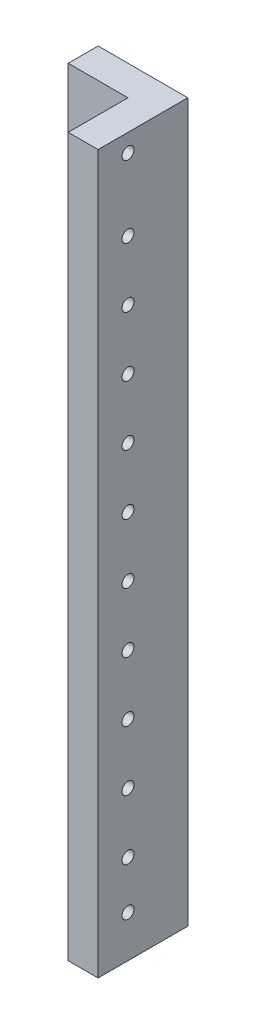
ISO-10303-21;
HEADER;
FILE_DESCRIPTION(('STEP AP214'),'2;1');
FILE_NAME('part.step','',(''),(''),'','','');
FILE_SCHEMA(('AUTOMOTIVE_DESIGN { 1 0 10303 214 1 1 1 1 }'));
ENDSEC;
DATA;
#1=APPLICATION_CONTEXT('core data for automotive mechanical design processes');
#2=APPLICATION_PROTOCOL_DEFINITION('international standard','automotive_design',2000,#1);
#3=PRODUCT_CONTEXT('',#1,'mechanical');
#4=PRODUCT('Part','Part','',(#3));
#5=PRODUCT_RELATED_PRODUCT_CATEGORY('part','',(#4));
#6=PRODUCT_DEFINITION_FORMATION('','',#4);
#7=PRODUCT_DEFINITION_CONTEXT('part definition',#1,'design');
#8=PRODUCT_DEFINITION('design','',#6,#7);
#9=PRODUCT_DEFINITION_SHAPE('','',#8);
#10=(LENGTH_UNIT() NAMED_UNIT(*) SI_UNIT(.MILLI.,.METRE.));
#11=(NAMED_UNIT(*) PLANE_ANGLE_UNIT() SI_UNIT($,.RADIAN.));
#12=(NAMED_UNIT(*) SI_UNIT($,.STERADIAN.) SOLID_ANGLE_UNIT());
#13=UNCERTAINTY_MEASURE_WITH_UNIT(LENGTH_MEASURE(1.E-05),#10,'distance_accuracy_value','');
#14=(GEOMETRIC_REPRESENTATION_CONTEXT(3) GLOBAL_UNCERTAINTY_ASSIGNED_CONTEXT((#13)) GLOBAL_UNIT_ASSIGNED_CONTEXT((#10,
#11,#12)) REPRESENTATION_CONTEXT('',''));
#15=CARTESIAN_POINT('',(0.,0.,0.));
#16=DIRECTION('',(0.,0.,1.));
#17=DIRECTION('',(1.,0.,0.));
#18=AXIS2_PLACEMENT_3D('',#15,#16,#17);
#19=CARTESIAN_POINT('',(-19.6614787517642,120.,-6.60714285714286));
#20=DIRECTION('',(1.,0.,0.));
#21=DIRECTION('',(0.,0.,-1.));
#22=AXIS2_PLACEMENT_3D('',#19,#20,#21);
#23=PLANE('',#22);
#24=DIRECTION('',(0.,0.,1.));
#25=VECTOR('',#24,1.);
#26=CARTESIAN_POINT('',(-19.6614787517642,0.,-6.60714285714286));
#27=LINE('',#26,#25);
#28=CARTESIAN_POINT('',(-19.6614787517642,0.,-6.60714285714286));
#29=VERTEX_POINT('',#28);
#30=CARTESIAN_POINT('',(-19.6614787517642,0.,-1.60714285714286));
#31=VERTEX_POINT('',#30);
#32=EDGE_CURVE('E119',#29,#31,#27,.T.);
#33=ORIENTED_EDGE('',*,*,#32,.T.);
#34=DIRECTION('',(0.,-1.,0.));
#35=VECTOR('',#34,1.);
#36=CARTESIAN_POINT('',(-19.6614787517642,120.,-1.60714285714286));
#37=LINE('',#36,#35);
#38=CARTESIAN_POINT('',(-19.6614787517642,120.,-1.60714285714286));
#39=VERTEX_POINT('',#38);
#40=EDGE_CURVE('E11',#39,#31,#37,.T.);
#41=ORIENTED_EDGE('',*,*,#40,.F.);
#42=DIRECTION('',(0.,0.,1.));
#43=VECTOR('',#42,1.);
#44=CARTESIAN_POINT('',(-19.6614787517642,120.,-6.60714285714286));
#45=LINE('',#44,#43);
#46=CARTESIAN_POINT('',(-19.6614787517642,120.,-6.60714285714286));
#47=VERTEX_POINT('',#46);
#48=EDGE_CURVE('E130',#47,#39,#45,.T.);
#49=ORIENTED_EDGE('',*,*,#48,.F.);
#50=DIRECTION('',(0.,-1.,0.));
#51=VECTOR('',#50,1.);
#52=CARTESIAN_POINT('',(-19.6614787517642,120.,-6.60714285714286));
#53=LINE('',#52,#51);
#54=EDGE_CURVE('E115',#47,#29,#53,.T.);
#55=ORIENTED_EDGE('',*,*,#54,.T.);
#56=EDGE_LOOP('',(#33,#41,#49,#55));
#57=FACE_BOUND('',#56,.T.);
#58=ADVANCED_FACE('F35',(#57),#23,.F.);
#59=CARTESIAN_POINT('',(-19.6614787517642,120.,-1.60714285714286));
#60=DIRECTION('',(0.,0.,-1.));
#61=DIRECTION('',(-1.,0.,0.));
#62=AXIS2_PLACEMENT_3D('',#59,#60,#61);
#63=PLANE('',#62);
#64=CARTESIAN_POINT('',(-14.6614787517642,15.,-1.60714285714285));
#65=DIRECTION('',(0.,0.,-1.));
#66=DIRECTION('',(-1.,0.,0.));
#67=AXIS2_PLACEMENT_3D('',#64,#65,#66);
#68=CIRCLE('',#67,1.);
#69=CARTESIAN_POINT('',(-15.6614787517642,15.,-1.60714285714285));
#70=VERTEX_POINT('',#69);
#71=EDGE_CURVE('E515',#70,#70,#68,.T.);
#72=ORIENTED_EDGE('',*,*,#71,.T.);
#73=EDGE_LOOP('',(#72));
#74=FACE_BOUND('',#73,.T.);
#75=CARTESIAN_POINT('',(-14.6614787517641,25.,-1.60714285714285));
#76=DIRECTION('',(0.,0.,-1.));
#77=DIRECTION('',(-1.,0.,0.));
#78=AXIS2_PLACEMENT_3D('',#75,#76,#77);
#79=CIRCLE('',#78,1.);
#80=CARTESIAN_POINT('',(-15.6614787517641,25.,-1.60714285714285));
#81=VERTEX_POINT('',#80);
#82=EDGE_CURVE('E542',#81,#81,#79,.T.);
#83=ORIENTED_EDGE('',*,*,#82,.T.);
#84=EDGE_LOOP('',(#83));
#85=FACE_BOUND('',#84,.T.);
#86=CARTESIAN_POINT('',(-14.6614787517641,35.,-1.60714285714285));
#87=DIRECTION('',(0.,0.,-1.));
#88=DIRECTION('',(-1.,0.,0.));
#89=AXIS2_PLACEMENT_3D('',#86,#87,#88);
#90=CIRCLE('',#89,1.);
#91=CARTESIAN_POINT('',(-15.6614787517641,35.,-1.60714285714285));
#92=VERTEX_POINT('',#91);
#93=EDGE_CURVE('E545',#92,#92,#90,.T.);
#94=ORIENTED_EDGE('',*,*,#93,.T.);
#95=EDGE_LOOP('',(#94));
#96=FACE_BOUND('',#95,.T.);
#97=CARTESIAN_POINT('',(-14.661478751764,45.,-1.60714285714285));
#98=DIRECTION('',(0.,0.,-1.));
#99=DIRECTION('',(-1.,0.,0.));
#100=AXIS2_PLACEMENT_3D('',#97,#98,#99);
#101=CIRCLE('',#100,1.);
#102=CARTESIAN_POINT('',(-15.661478751764,45.,-1.60714285714285));
#103=VERTEX_POINT('',#102);
#104=EDGE_CURVE('E548',#103,#103,#101,.T.);
#105=ORIENTED_EDGE('',*,*,#104,.T.);
#106=EDGE_LOOP('',(#105));
#107=FACE_BOUND('',#106,.T.);
#108=CARTESIAN_POINT('',(-14.661478751764,55.,-1.60714285714285));
#109=DIRECTION('',(0.,0.,-1.));
#110=DIRECTION('',(-1.,0.,0.));
#111=AXIS2_PLACEMENT_3D('',#108,#109,#110);
#112=CIRCLE('',#111,1.);
#113=CARTESIAN_POINT('',(-15.661478751764,55.,-1.60714285714285));
#114=VERTEX_POINT('',#113);
#115=EDGE_CURVE('E551',#114,#114,#112,.T.);
#116=ORIENTED_EDGE('',*,*,#115,.T.);
#117=EDGE_LOOP('',(#116));
#118=FACE_BOUND('',#117,.T.);
#119=CARTESIAN_POINT('',(-14.661478751764,65.,-1.60714285714285));
#120=DIRECTION('',(0.,0.,-1.));
#121=DIRECTION('',(-1.,0.,0.));
#122=AXIS2_PLACEMENT_3D('',#119,#120,#121);
#123=CIRCLE('',#122,1.);
#124=CARTESIAN_POINT('',(-15.661478751764,65.,-1.60714285714285));
#125=VERTEX_POINT('',#124);
#126=EDGE_CURVE('E554',#125,#125,#123,.T.);
#127=ORIENTED_EDGE('',*,*,#126,.T.);
#128=EDGE_LOOP('',(#127));
#129=FACE_BOUND('',#128,.T.);
#130=CARTESIAN_POINT('',(-14.6614787517639,75.,-1.60714285714285));
#131=DIRECTION('',(0.,0.,-1.));
#132=DIRECTION('',(-1.,0.,0.));
#133=AXIS2_PLACEMENT_3D('',#130,#131,#132);
#134=CIRCLE('',#133,1.);
#135=CARTESIAN_POINT('',(-15.6614787517639,75.,-1.60714285714285));
#136=VERTEX_POINT('',#135);
#137=EDGE_CURVE('E557',#136,#136,#134,.T.);
#138=ORIENTED_EDGE('',*,*,#137,.T.);
#139=EDGE_LOOP('',(#138));
#140=FACE_BOUND('',#139,.T.);
#141=CARTESIAN_POINT('',(-14.6614787517639,85.,-1.60714285714285));
#142=DIRECTION('',(0.,0.,-1.));
#143=DIRECTION('',(-1.,0.,0.));
#144=AXIS2_PLACEMENT_3D('',#141,#142,#143);
#145=CIRCLE('',#144,1.);
#146=CARTESIAN_POINT('',(-15.6614787517639,85.,-1.60714285714285));
#147=VERTEX_POINT('',#146);
#148=EDGE_CURVE('E560',#147,#147,#145,.T.);
#149=ORIENTED_EDGE('',*,*,#148,.T.);
#150=EDGE_LOOP('',(#149));
#151=FACE_BOUND('',#150,.T.);
#152=CARTESIAN_POINT('',(-14.6614787517639,95.,-1.60714285714285));
#153=DIRECTION('',(0.,0.,-1.));
#154=DIRECTION('',(-1.,0.,0.));
#155=AXIS2_PLACEMENT_3D('',#152,#153,#154);
#156=CIRCLE('',#155,1.);
#157=CARTESIAN_POINT('',(-15.6614787517639,95.,-1.60714285714285));
#158=VERTEX_POINT('',#157);
#159=EDGE_CURVE('E563',#158,#158,#156,.T.);
#160=ORIENTED_EDGE('',*,*,#159,.T.);
#161=EDGE_LOOP('',(#160));
#162=FACE_BOUND('',#161,.T.);
#163=CARTESIAN_POINT('',(-14.6614787517638,105.,-1.60714285714285));
#164=DIRECTION('',(0.,0.,-1.));
#165=DIRECTION('',(-1.,0.,0.));
#166=AXIS2_PLACEMENT_3D('',#163,#164,#165);
#167=CIRCLE('',#166,1.);
#168=CARTESIAN_POINT('',(-15.6614787517638,105.,-1.60714285714285));
#169=VERTEX_POINT('',#168);
#170=EDGE_CURVE('E566',#169,#169,#167,.T.);
#171=ORIENTED_EDGE('',*,*,#170,.T.);
#172=EDGE_LOOP('',(#171));
#173=FACE_BOUND('',#172,.T.);
#174=CARTESIAN_POINT('',(-14.6614787517642,3.,-1.60714285714285));
#175=DIRECTION('',(0.,0.,-1.));
#176=DIRECTION('',(-1.,0.,0.));
#177=AXIS2_PLACEMENT_3D('',#174,#175,#176);
#178=CIRCLE('',#177,1.);
#179=CARTESIAN_POINT('',(-15.6614787517642,3.,-1.60714285714285));
#180=VERTEX_POINT('',#179);
#181=EDGE_CURVE('E474',#180,#180,#178,.T.);
#182=ORIENTED_EDGE('',*,*,#181,.T.);
#183=EDGE_LOOP('',(#182));
#184=FACE_BOUND('',#183,.T.);
#185=CARTESIAN_POINT('',(-14.6614787517642,113.,-1.60714285714285));
#186=DIRECTION('',(0.,0.,-1.));
#187=DIRECTION('',(-1.,0.,0.));
#188=AXIS2_PLACEMENT_3D('',#185,#186,#187);
#189=CIRCLE('',#188,1.);
#190=CARTESIAN_POINT('',(-15.6614787517642,113.,-1.60714285714285));
#191=VERTEX_POINT('',#190);
#192=EDGE_CURVE('E458',#191,#191,#189,.T.);
#193=ORIENTED_EDGE('',*,*,#192,.T.);
#194=EDGE_LOOP('',(#193));
#195=FACE_BOUND('',#194,.T.);
#196=DIRECTION('',(1.,0.,0.));
#197=VECTOR('',#196,1.);
#198=CARTESIAN_POINT('',(-19.6614787517642,0.,-1.60714285714286));
#199=LINE('',#198,#197);
#200=CARTESIAN_POINT('',(-9.66147875176415,0.,-1.60714285714286));
#201=VERTEX_POINT('',#200);
#202=EDGE_CURVE('E122',#31,#201,#199,.T.);
#203=ORIENTED_EDGE('',*,*,#202,.T.);
#204=DIRECTION('',(0.,-1.,0.));
#205=VECTOR('',#204,1.);
#206=CARTESIAN_POINT('',(-9.66147875176415,120.,-1.60714285714286));
#207=LINE('',#206,#205);
#208=CARTESIAN_POINT('',(-9.66147875176415,120.,-1.60714285714286));
#209=VERTEX_POINT('',#208);
#210=EDGE_CURVE('E43',#209,#201,#207,.T.);
#211=ORIENTED_EDGE('',*,*,#210,.F.);
#212=DIRECTION('',(1.,0.,0.));
#213=VECTOR('',#212,1.);
#214=CARTESIAN_POINT('',(-19.6614787517642,120.,-1.60714285714286));
#215=LINE('',#214,#213);
#216=EDGE_CURVE('E88',#39,#209,#215,.T.);
#217=ORIENTED_EDGE('',*,*,#216,.F.);
#218=ORIENTED_EDGE('',*,*,#40,.T.);
#219=EDGE_LOOP('',(#203,#211,#217,#218));
#220=FACE_BOUND('',#219,.T.);
#221=ADVANCED_FACE('F158',(#74,#85,#96,#107,#118,#129,#140,#151,#162,#173,#184,#195,#220),#63,.F.);
#222=CARTESIAN_POINT('',(-9.66147875176415,120.,-1.60714285714286));
#223=DIRECTION('',(1.,0.,0.));
#224=DIRECTION('',(0.,0.,-1.));
#225=AXIS2_PLACEMENT_3D('',#222,#223,#224);
#226=PLANE('',#225);
#227=CARTESIAN_POINT('',(-9.66147875176415,105.,3.39285714285714));
#228=DIRECTION('',(1.,0.,0.));
#229=DIRECTION('',(0.,0.,-1.));
#230=AXIS2_PLACEMENT_3D('',#227,#228,#229);
#231=CIRCLE('',#230,1.);
#232=CARTESIAN_POINT('',(-9.66147875176415,105.,2.39285714285714));
#233=VERTEX_POINT('',#232);
#234=EDGE_CURVE('E480',#233,#233,#231,.T.);
#235=ORIENTED_EDGE('',*,*,#234,.T.);
#236=EDGE_LOOP('',(#235));
#237=FACE_BOUND('',#236,.T.);
#238=CARTESIAN_POINT('',(-9.66147875176415,95.,3.39285714285704));
#239=DIRECTION('',(1.,0.,0.));
#240=DIRECTION('',(0.,0.,-1.));
#241=AXIS2_PLACEMENT_3D('',#238,#239,#240);
#242=CIRCLE('',#241,1.);
#243=CARTESIAN_POINT('',(-9.66147875176415,95.,2.39285714285704));
#244=VERTEX_POINT('',#243);
#245=EDGE_CURVE('E483',#244,#244,#242,.T.);
#246=ORIENTED_EDGE('',*,*,#245,.T.);
#247=EDGE_LOOP('',(#246));
#248=FACE_BOUND('',#247,.T.);
#249=CARTESIAN_POINT('',(-9.66147875176415,85.,3.39285714285693));
#250=DIRECTION('',(1.,0.,0.));
#251=DIRECTION('',(0.,0.,-1.));
#252=AXIS2_PLACEMENT_3D('',#249,#250,#251);
#253=CIRCLE('',#252,1.);
#254=CARTESIAN_POINT('',(-9.66147875176415,85.,2.39285714285693));
#255=VERTEX_POINT('',#254);
#256=EDGE_CURVE('E486',#255,#255,#253,.T.);
#257=ORIENTED_EDGE('',*,*,#256,.T.);
#258=EDGE_LOOP('',(#257));
#259=FACE_BOUND('',#258,.T.);
#260=CARTESIAN_POINT('',(-9.66147875176415,75.,3.39285714285683));
#261=DIRECTION('',(1.,0.,0.));
#262=DIRECTION('',(0.,0.,-1.));
#263=AXIS2_PLACEMENT_3D('',#260,#261,#262);
#264=CIRCLE('',#263,1.);
#265=CARTESIAN_POINT('',(-9.66147875176415,75.,2.39285714285683));
#266=VERTEX_POINT('',#265);
#267=EDGE_CURVE('E489',#266,#266,#264,.T.);
#268=ORIENTED_EDGE('',*,*,#267,.T.);
#269=EDGE_LOOP('',(#268));
#270=FACE_BOUND('',#269,.T.);
#271=CARTESIAN_POINT('',(-9.66147875176415,65.,3.39285714285673));
#272=DIRECTION('',(1.,0.,0.));
#273=DIRECTION('',(0.,0.,-1.));
#274=AXIS2_PLACEMENT_3D('',#271,#272,#273);
#275=CIRCLE('',#274,1.);
#276=CARTESIAN_POINT('',(-9.66147875176415,65.,2.39285714285673));
#277=VERTEX_POINT('',#276);
#278=EDGE_CURVE('E492',#277,#277,#275,.T.);
#279=ORIENTED_EDGE('',*,*,#278,.T.);
#280=EDGE_LOOP('',(#279));
#281=FACE_BOUND('',#280,.T.);
#282=CARTESIAN_POINT('',(-9.66147875176415,55.,3.39285714285662));
#283=DIRECTION('',(1.,0.,0.));
#284=DIRECTION('',(0.,0.,-1.));
#285=AXIS2_PLACEMENT_3D('',#282,#283,#284);
#286=CIRCLE('',#285,1.);
#287=CARTESIAN_POINT('',(-9.66147875176415,55.,2.39285714285662));
#288=VERTEX_POINT('',#287);
#289=EDGE_CURVE('E495',#288,#288,#286,.T.);
#290=ORIENTED_EDGE('',*,*,#289,.T.);
#291=EDGE_LOOP('',(#290));
#292=FACE_BOUND('',#291,.T.);
#293=CARTESIAN_POINT('',(-9.66147875176415,45.,3.39285714285652));
#294=DIRECTION('',(1.,0.,0.));
#295=DIRECTION('',(0.,0.,-1.));
#296=AXIS2_PLACEMENT_3D('',#293,#294,#295);
#297=CIRCLE('',#296,1.);
#298=CARTESIAN_POINT('',(-9.66147875176415,45.,2.39285714285652));
#299=VERTEX_POINT('',#298);
#300=EDGE_CURVE('E498',#299,#299,#297,.T.);
#301=ORIENTED_EDGE('',*,*,#300,.T.);
#302=EDGE_LOOP('',(#301));
#303=FACE_BOUND('',#302,.T.);
#304=CARTESIAN_POINT('',(-9.66147875176415,35.,3.39285714285641));
#305=DIRECTION('',(1.,0.,0.));
#306=DIRECTION('',(0.,0.,-1.));
#307=AXIS2_PLACEMENT_3D('',#304,#305,#306);
#308=CIRCLE('',#307,1.);
#309=CARTESIAN_POINT('',(-9.66147875176415,35.,2.39285714285641));
#310=VERTEX_POINT('',#309);
#311=EDGE_CURVE('E501',#310,#310,#308,.T.);
#312=ORIENTED_EDGE('',*,*,#311,.T.);
#313=EDGE_LOOP('',(#312));
#314=FACE_BOUND('',#313,.T.);
#315=CARTESIAN_POINT('',(-9.66147875176415,25.,3.39285714285631));
#316=DIRECTION('',(1.,0.,0.));
#317=DIRECTION('',(0.,0.,-1.));
#318=AXIS2_PLACEMENT_3D('',#315,#316,#317);
#319=CIRCLE('',#318,1.);
#320=CARTESIAN_POINT('',(-9.66147875176415,25.,2.39285714285631));
#321=VERTEX_POINT('',#320);
#322=EDGE_CURVE('E504',#321,#321,#319,.T.);
#323=ORIENTED_EDGE('',*,*,#322,.T.);
#324=EDGE_LOOP('',(#323));
#325=FACE_BOUND('',#324,.T.);
#326=CARTESIAN_POINT('',(-9.66147875176415,15.,3.39285714285621));
#327=DIRECTION('',(1.,0.,0.));
#328=DIRECTION('',(0.,0.,-1.));
#329=AXIS2_PLACEMENT_3D('',#326,#327,#328);
#330=CIRCLE('',#329,1.);
#331=CARTESIAN_POINT('',(-9.66147875176415,15.,2.39285714285621));
#332=VERTEX_POINT('',#331);
#333=EDGE_CURVE('E507',#332,#332,#330,.T.);
#334=ORIENTED_EDGE('',*,*,#333,.T.);
#335=EDGE_LOOP('',(#334));
#336=FACE_BOUND('',#335,.T.);
#337=CARTESIAN_POINT('',(-9.66147875176415,7.00000000000001,3.39285714285714));
#338=DIRECTION('',(1.,0.,0.));
#339=DIRECTION('',(0.,0.,-1.));
#340=AXIS2_PLACEMENT_3D('',#337,#338,#339);
#341=CIRCLE('',#340,1.);
#342=CARTESIAN_POINT('',(-9.66147875176415,7.00000000000001,2.39285714285714));
#343=VERTEX_POINT('',#342);
#344=EDGE_CURVE('E468',#343,#343,#341,.T.);
#345=ORIENTED_EDGE('',*,*,#344,.T.);
#346=EDGE_LOOP('',(#345));
#347=FACE_BOUND('',#346,.T.);
#348=CARTESIAN_POINT('',(-9.66147875176415,117.,3.39285714285714));
#349=DIRECTION('',(1.,0.,0.));
#350=DIRECTION('',(0.,0.,-1.));
#351=AXIS2_PLACEMENT_3D('',#348,#349,#350);
#352=CIRCLE('',#351,1.);
#353=CARTESIAN_POINT('',(-9.66147875176415,117.,2.39285714285714));
#354=VERTEX_POINT('',#353);
#355=EDGE_CURVE('E123',#354,#354,#352,.T.);
#356=ORIENTED_EDGE('',*,*,#355,.T.);
#357=EDGE_LOOP('',(#356));
#358=FACE_BOUND('',#357,.T.);
#359=DIRECTION('',(0.,0.,1.));
#360=VECTOR('',#359,1.);
#361=CARTESIAN_POINT('',(-9.66147875176415,0.,-1.60714285714286));
#362=LINE('',#361,#360);
#363=CARTESIAN_POINT('',(-9.66147875176415,0.,8.39285714285714));
#364=VERTEX_POINT('',#363);
#365=EDGE_CURVE('E125',#201,#364,#362,.T.);
#366=ORIENTED_EDGE('',*,*,#365,.T.);
#367=DIRECTION('',(0.,-1.,0.));
#368=VECTOR('',#367,1.);
#369=CARTESIAN_POINT('',(-9.66147875176415,120.,8.39285714285714));
#370=LINE('',#369,#368);
#371=CARTESIAN_POINT('',(-9.66147875176415,120.,8.39285714285714));
#372=VERTEX_POINT('',#371);
#373=EDGE_CURVE('E110',#372,#364,#370,.T.);
#374=ORIENTED_EDGE('',*,*,#373,.F.);
#375=DIRECTION('',(0.,0.,1.));
#376=VECTOR('',#375,1.);
#377=CARTESIAN_POINT('',(-9.66147875176415,120.,-1.60714285714286));
#378=LINE('',#377,#376);
#379=EDGE_CURVE('E101',#209,#372,#378,.T.);
#380=ORIENTED_EDGE('',*,*,#379,.F.);
#381=ORIENTED_EDGE('',*,*,#210,.T.);
#382=EDGE_LOOP('',(#366,#374,#380,#381));
#383=FACE_BOUND('',#382,.T.);
#384=ADVANCED_FACE('F136',(#237,#248,#259,#270,#281,#292,#303,#314,#325,#336,#347,#358,#383),
#226,.F.);
#385=CARTESIAN_POINT('',(-4.66147875176415,120.,8.39285714285714));
#386=DIRECTION('',(0.,0.,-1.));
#387=DIRECTION('',(-1.,0.,0.));
#388=AXIS2_PLACEMENT_3D('',#385,#386,#387);
#389=PLANE('',#388);
#390=DIRECTION('',(1.,0.,0.));
#391=VECTOR('',#390,1.);
#392=CARTESIAN_POINT('',(-4.66147875176415,0.,8.39285714285714));
#393=LINE('',#392,#391);
#394=CARTESIAN_POINT('',(-4.66147875176415,0.,8.39285714285714));
#395=VERTEX_POINT('',#394);
#396=EDGE_CURVE('E109',#364,#395,#393,.T.);
#397=ORIENTED_EDGE('',*,*,#396,.T.);
#398=DIRECTION('',(0.,-1.,0.));
#399=VECTOR('',#398,1.);
#400=CARTESIAN_POINT('',(-4.66147875176415,120.,8.39285714285714));
#401=LINE('',#400,#399);
#402=CARTESIAN_POINT('',(-4.66147875176415,120.,8.39285714285714));
#403=VERTEX_POINT('',#402);
#404=EDGE_CURVE('E106',#403,#395,#401,.T.);
#405=ORIENTED_EDGE('',*,*,#404,.F.);
#406=DIRECTION('',(1.,0.,0.));
#407=VECTOR('',#406,1.);
#408=CARTESIAN_POINT('',(-4.66147875176415,120.,8.39285714285714));
#409=LINE('',#408,#407);
#410=EDGE_CURVE('E95',#372,#403,#409,.T.);
#411=ORIENTED_EDGE('',*,*,#410,.F.);
#412=ORIENTED_EDGE('',*,*,#373,.T.);
#413=EDGE_LOOP('',(#397,#405,#411,#412));
#414=FACE_BOUND('',#413,.T.);
#415=ADVANCED_FACE('F107',(#414),#389,.F.);
#416=CARTESIAN_POINT('',(-4.66147875176415,120.,-6.60714285714286));
#417=DIRECTION('',(-1.,0.,0.));
#418=DIRECTION('',(0.,0.,1.));
#419=AXIS2_PLACEMENT_3D('',#416,#417,#418);
#420=PLANE('',#419);
#421=CARTESIAN_POINT('',(-4.66147875176415,105.,3.39285714285714));
#422=DIRECTION('',(1.,0.,0.));
#423=DIRECTION('',(0.,0.,-1.));
#424=AXIS2_PLACEMENT_3D('',#421,#422,#423);
#425=CIRCLE('',#424,1.);
#426=CARTESIAN_POINT('',(-4.66147875176415,105.,2.39285714285714));
#427=VERTEX_POINT('',#426);
#428=EDGE_CURVE('E510',#427,#427,#425,.T.);
#429=ORIENTED_EDGE('',*,*,#428,.F.);
#430=EDGE_LOOP('',(#429));
#431=FACE_BOUND('',#430,.T.);
#432=CARTESIAN_POINT('',(-4.66147875176415,95.,3.39285714285704));
#433=DIRECTION('',(1.,0.,0.));
#434=DIRECTION('',(0.,0.,-1.));
#435=AXIS2_PLACEMENT_3D('',#432,#433,#434);
#436=CIRCLE('',#435,1.);
#437=CARTESIAN_POINT('',(-4.66147875176415,95.,2.39285714285704));
#438=VERTEX_POINT('',#437);
#439=EDGE_CURVE('E536',#438,#438,#436,.T.);
#440=ORIENTED_EDGE('',*,*,#439,.F.);
#441=EDGE_LOOP('',(#440));
#442=FACE_BOUND('',#441,.T.);
#443=CARTESIAN_POINT('',(-4.66147875176415,85.,3.39285714285693));
#444=DIRECTION('',(1.,0.,0.));
#445=DIRECTION('',(0.,0.,-1.));
#446=AXIS2_PLACEMENT_3D('',#443,#444,#445);
#447=CIRCLE('',#446,1.);
#448=CARTESIAN_POINT('',(-4.66147875176415,85.,2.39285714285693));
#449=VERTEX_POINT('',#448);
#450=EDGE_CURVE('E533',#449,#449,#447,.T.);
#451=ORIENTED_EDGE('',*,*,#450,.F.);
#452=EDGE_LOOP('',(#451));
#453=FACE_BOUND('',#452,.T.);
#454=CARTESIAN_POINT('',(-4.66147875176415,75.,3.39285714285683));
#455=DIRECTION('',(1.,0.,0.));
#456=DIRECTION('',(0.,0.,-1.));
#457=AXIS2_PLACEMENT_3D('',#454,#455,#456);
#458=CIRCLE('',#457,1.);
#459=CARTESIAN_POINT('',(-4.66147875176415,75.,2.39285714285683));
#460=VERTEX_POINT('',#459);
#461=EDGE_CURVE('E530',#460,#460,#458,.T.);
#462=ORIENTED_EDGE('',*,*,#461,.F.);
#463=EDGE_LOOP('',(#462));
#464=FACE_BOUND('',#463,.T.);
#465=CARTESIAN_POINT('',(-4.66147875176415,65.,3.39285714285673));
#466=DIRECTION('',(1.,0.,0.));
#467=DIRECTION('',(0.,0.,-1.));
#468=AXIS2_PLACEMENT_3D('',#465,#466,#467);
#469=CIRCLE('',#468,1.);
#470=CARTESIAN_POINT('',(-4.66147875176415,65.,2.39285714285673));
#471=VERTEX_POINT('',#470);
#472=EDGE_CURVE('E527',#471,#471,#469,.T.);
#473=ORIENTED_EDGE('',*,*,#472,.F.);
#474=EDGE_LOOP('',(#473));
#475=FACE_BOUND('',#474,.T.);
#476=CARTESIAN_POINT('',(-4.66147875176415,55.,3.39285714285662));
#477=DIRECTION('',(1.,0.,0.));
#478=DIRECTION('',(0.,0.,-1.));
#479=AXIS2_PLACEMENT_3D('',#476,#477,#478);
#480=CIRCLE('',#479,1.);
#481=CARTESIAN_POINT('',(-4.66147875176415,55.,2.39285714285662));
#482=VERTEX_POINT('',#481);
#483=EDGE_CURVE('E524',#482,#482,#480,.T.);
#484=ORIENTED_EDGE('',*,*,#483,.F.);
#485=EDGE_LOOP('',(#484));
#486=FACE_BOUND('',#485,.T.);
#487=CARTESIAN_POINT('',(-4.66147875176415,45.,3.39285714285652));
#488=DIRECTION('',(1.,0.,0.));
#489=DIRECTION('',(0.,0.,-1.));
#490=AXIS2_PLACEMENT_3D('',#487,#488,#489);
#491=CIRCLE('',#490,1.);
#492=CARTESIAN_POINT('',(-4.66147875176415,45.,2.39285714285652));
#493=VERTEX_POINT('',#492);
#494=EDGE_CURVE('E521',#493,#493,#491,.T.);
#495=ORIENTED_EDGE('',*,*,#494,.F.);
#496=EDGE_LOOP('',(#495));
#497=FACE_BOUND('',#496,.T.);
#498=CARTESIAN_POINT('',(-4.66147875176415,35.,3.39285714285641));
#499=DIRECTION('',(1.,0.,0.));
#500=DIRECTION('',(0.,0.,-1.));
#501=AXIS2_PLACEMENT_3D('',#498,#499,#500);
#502=CIRCLE('',#501,1.);
#503=CARTESIAN_POINT('',(-4.66147875176415,35.,2.39285714285641));
#504=VERTEX_POINT('',#503);
#505=EDGE_CURVE('E518',#504,#504,#502,.T.);
#506=ORIENTED_EDGE('',*,*,#505,.F.);
#507=EDGE_LOOP('',(#506));
#508=FACE_BOUND('',#507,.T.);
#509=CARTESIAN_POINT('',(-4.66147875176415,25.,3.39285714285631));
#510=DIRECTION('',(1.,0.,0.));
#511=DIRECTION('',(0.,0.,-1.));
#512=AXIS2_PLACEMENT_3D('',#509,#510,#511);
#513=CIRCLE('',#512,1.);
#514=CARTESIAN_POINT('',(-4.66147875176415,25.,2.39285714285631));
#515=VERTEX_POINT('',#514);
#516=EDGE_CURVE('E514',#515,#515,#513,.T.);
#517=ORIENTED_EDGE('',*,*,#516,.F.);
#518=EDGE_LOOP('',(#517));
#519=FACE_BOUND('',#518,.T.);
#520=CARTESIAN_POINT('',(-4.66147875176415,15.,3.39285714285621));
#521=DIRECTION('',(1.,0.,0.));
#522=DIRECTION('',(0.,0.,-1.));
#523=AXIS2_PLACEMENT_3D('',#520,#521,#522);
#524=CIRCLE('',#523,1.);
#525=CARTESIAN_POINT('',(-4.66147875176415,15.,2.3928571428562));
#526=VERTEX_POINT('',#525);
#527=EDGE_CURVE('E511',#526,#526,#524,.T.);
#528=ORIENTED_EDGE('',*,*,#527,.F.);
#529=EDGE_LOOP('',(#528));
#530=FACE_BOUND('',#529,.T.);
#531=CARTESIAN_POINT('',(-4.66147875176415,7.00000000000001,3.39285714285714));
#532=DIRECTION('',(1.,0.,0.));
#533=DIRECTION('',(0.,0.,-1.));
#534=AXIS2_PLACEMENT_3D('',#531,#532,#533);
#535=CIRCLE('',#534,1.);
#536=CARTESIAN_POINT('',(-4.66147875176415,7.00000000000001,2.39285714285714));
#537=VERTEX_POINT('',#536);
#538=EDGE_CURVE('E471',#537,#537,#535,.T.);
#539=ORIENTED_EDGE('',*,*,#538,.F.);
#540=EDGE_LOOP('',(#539));
#541=FACE_BOUND('',#540,.T.);
#542=CARTESIAN_POINT('',(-4.66147875176415,117.,3.39285714285714));
#543=DIRECTION('',(1.,0.,0.));
#544=DIRECTION('',(0.,0.,-1.));
#545=AXIS2_PLACEMENT_3D('',#542,#543,#544);
#546=CIRCLE('',#545,1.);
#547=CARTESIAN_POINT('',(-4.66147875176415,117.,2.39285714285714));
#548=VERTEX_POINT('',#547);
#549=EDGE_CURVE('E453',#548,#548,#546,.T.);
#550=ORIENTED_EDGE('',*,*,#549,.F.);
#551=EDGE_LOOP('',(#550));
#552=FACE_BOUND('',#551,.T.);
#553=DIRECTION('',(0.,0.,-1.));
#554=VECTOR('',#553,1.);
#555=CARTESIAN_POINT('',(-4.66147875176415,0.,-6.60714285714286));
#556=LINE('',#555,#554);
#557=CARTESIAN_POINT('',(-4.66147875176415,0.,-6.60714285714286));
#558=VERTEX_POINT('',#557);
#559=EDGE_CURVE('E74',#395,#558,#556,.T.);
#560=ORIENTED_EDGE('',*,*,#559,.T.);
#561=DIRECTION('',(0.,-1.,0.));
#562=VECTOR('',#561,1.);
#563=CARTESIAN_POINT('',(-4.66147875176415,120.,-6.60714285714286));
#564=LINE('',#563,#562);
#565=CARTESIAN_POINT('',(-4.66147875176415,120.,-6.60714285714286));
#566=VERTEX_POINT('',#565);
#567=EDGE_CURVE('E111',#566,#558,#564,.T.);
#568=ORIENTED_EDGE('',*,*,#567,.F.);
#569=DIRECTION('',(0.,0.,-1.));
#570=VECTOR('',#569,1.);
#571=CARTESIAN_POINT('',(-4.66147875176415,120.,-6.60714285714286));
#572=LINE('',#571,#570);
#573=EDGE_CURVE('E99',#403,#566,#572,.T.);
#574=ORIENTED_EDGE('',*,*,#573,.F.);
#575=ORIENTED_EDGE('',*,*,#404,.T.);
#576=EDGE_LOOP('',(#560,#568,#574,#575));
#577=FACE_BOUND('',#576,.T.);
#578=ADVANCED_FACE('F113',(#431,#442,#453,#464,#475,#486,#497,#508,#519,#530,#541,#552,#577),
#420,.F.);
#579=CARTESIAN_POINT('',(-19.6614787517642,120.,-6.60714285714286));
#580=DIRECTION('',(0.,0.,1.));
#581=DIRECTION('',(1.,0.,0.));
#582=AXIS2_PLACEMENT_3D('',#579,#580,#581);
#583=PLANE('',#582);
#584=CARTESIAN_POINT('',(-14.6614787517642,15.,-6.60714285714286));
#585=DIRECTION('',(0.,0.,-1.));
#586=DIRECTION('',(-1.,0.,0.));
#587=AXIS2_PLACEMENT_3D('',#584,#585,#586);
#588=CIRCLE('',#587,1.);
#589=CARTESIAN_POINT('',(-15.6614787517642,15.,-6.60714285714286));
#590=VERTEX_POINT('',#589);
#591=EDGE_CURVE('E569',#590,#590,#588,.T.);
#592=ORIENTED_EDGE('',*,*,#591,.F.);
#593=EDGE_LOOP('',(#592));
#594=FACE_BOUND('',#593,.T.);
#595=CARTESIAN_POINT('',(-14.6614787517641,25.,-6.60714285714286));
#596=DIRECTION('',(0.,0.,-1.));
#597=DIRECTION('',(-1.,0.,0.));
#598=AXIS2_PLACEMENT_3D('',#595,#596,#597);
#599=CIRCLE('',#598,1.);
#600=CARTESIAN_POINT('',(-15.6614787517641,25.,-6.60714285714286));
#601=VERTEX_POINT('',#600);
#602=EDGE_CURVE('E594',#601,#601,#599,.T.);
#603=ORIENTED_EDGE('',*,*,#602,.F.);
#604=EDGE_LOOP('',(#603));
#605=FACE_BOUND('',#604,.T.);
#606=CARTESIAN_POINT('',(-14.6614787517641,35.,-6.60714285714286));
#607=DIRECTION('',(0.,0.,-1.));
#608=DIRECTION('',(-1.,0.,0.));
#609=AXIS2_PLACEMENT_3D('',#606,#607,#608);
#610=CIRCLE('',#609,1.);
#611=CARTESIAN_POINT('',(-15.6614787517641,35.,-6.60714285714286));
#612=VERTEX_POINT('',#611);
#613=EDGE_CURVE('E591',#612,#612,#610,.T.);
#614=ORIENTED_EDGE('',*,*,#613,.F.);
#615=EDGE_LOOP('',(#614));
#616=FACE_BOUND('',#615,.T.);
#617=CARTESIAN_POINT('',(-14.661478751764,45.,-6.60714285714286));
#618=DIRECTION('',(0.,0.,-1.));
#619=DIRECTION('',(-1.,0.,0.));
#620=AXIS2_PLACEMENT_3D('',#617,#618,#619);
#621=CIRCLE('',#620,1.);
#622=CARTESIAN_POINT('',(-15.661478751764,45.,-6.60714285714286));
#623=VERTEX_POINT('',#622);
#624=EDGE_CURVE('E588',#623,#623,#621,.T.);
#625=ORIENTED_EDGE('',*,*,#624,.F.);
#626=EDGE_LOOP('',(#625));
#627=FACE_BOUND('',#626,.T.);
#628=CARTESIAN_POINT('',(-14.661478751764,55.,-6.60714285714286));
#629=DIRECTION('',(0.,0.,-1.));
#630=DIRECTION('',(-1.,0.,0.));
#631=AXIS2_PLACEMENT_3D('',#628,#629,#630);
#632=CIRCLE('',#631,1.);
#633=CARTESIAN_POINT('',(-15.661478751764,55.,-6.60714285714286));
#634=VERTEX_POINT('',#633);
#635=EDGE_CURVE('E585',#634,#634,#632,.T.);
#636=ORIENTED_EDGE('',*,*,#635,.F.);
#637=EDGE_LOOP('',(#636));
#638=FACE_BOUND('',#637,.T.);
#639=CARTESIAN_POINT('',(-14.661478751764,65.,-6.60714285714286));
#640=DIRECTION('',(0.,0.,-1.));
#641=DIRECTION('',(-1.,0.,0.));
#642=AXIS2_PLACEMENT_3D('',#639,#640,#641);
#643=CIRCLE('',#642,1.);
#644=CARTESIAN_POINT('',(-15.661478751764,65.,-6.60714285714286));
#645=VERTEX_POINT('',#644);
#646=EDGE_CURVE('E582',#645,#645,#643,.T.);
#647=ORIENTED_EDGE('',*,*,#646,.F.);
#648=EDGE_LOOP('',(#647));
#649=FACE_BOUND('',#648,.T.);
#650=CARTESIAN_POINT('',(-14.6614787517639,75.,-6.60714285714286));
#651=DIRECTION('',(0.,0.,-1.));
#652=DIRECTION('',(-1.,0.,0.));
#653=AXIS2_PLACEMENT_3D('',#650,#651,#652);
#654=CIRCLE('',#653,1.);
#655=CARTESIAN_POINT('',(-15.6614787517639,75.,-6.60714285714286));
#656=VERTEX_POINT('',#655);
#657=EDGE_CURVE('E579',#656,#656,#654,.T.);
#658=ORIENTED_EDGE('',*,*,#657,.F.);
#659=EDGE_LOOP('',(#658));
#660=FACE_BOUND('',#659,.T.);
#661=CARTESIAN_POINT('',(-14.6614787517639,85.,-6.60714285714286));
#662=DIRECTION('',(0.,0.,-1.));
#663=DIRECTION('',(-1.,0.,0.));
#664=AXIS2_PLACEMENT_3D('',#661,#662,#663);
#665=CIRCLE('',#664,1.);
#666=CARTESIAN_POINT('',(-15.6614787517639,85.,-6.60714285714286));
#667=VERTEX_POINT('',#666);
#668=EDGE_CURVE('E576',#667,#667,#665,.T.);
#669=ORIENTED_EDGE('',*,*,#668,.F.);
#670=EDGE_LOOP('',(#669));
#671=FACE_BOUND('',#670,.T.);
#672=CARTESIAN_POINT('',(-14.6614787517639,95.,-6.60714285714286));
#673=DIRECTION('',(0.,0.,-1.));
#674=DIRECTION('',(-1.,0.,0.));
#675=AXIS2_PLACEMENT_3D('',#672,#673,#674);
#676=CIRCLE('',#675,1.);
#677=CARTESIAN_POINT('',(-15.6614787517639,95.,-6.60714285714286));
#678=VERTEX_POINT('',#677);
#679=EDGE_CURVE('E573',#678,#678,#676,.T.);
#680=ORIENTED_EDGE('',*,*,#679,.F.);
#681=EDGE_LOOP('',(#680));
#682=FACE_BOUND('',#681,.T.);
#683=CARTESIAN_POINT('',(-14.6614787517638,105.,-6.60714285714286));
#684=DIRECTION('',(0.,0.,-1.));
#685=DIRECTION('',(-1.,0.,0.));
#686=AXIS2_PLACEMENT_3D('',#683,#684,#685);
#687=CIRCLE('',#686,1.);
#688=CARTESIAN_POINT('',(-15.6614787517638,105.,-6.60714285714286));
#689=VERTEX_POINT('',#688);
#690=EDGE_CURVE('E570',#689,#689,#687,.T.);
#691=ORIENTED_EDGE('',*,*,#690,.F.);
#692=EDGE_LOOP('',(#691));
#693=FACE_BOUND('',#692,.T.);
#694=CARTESIAN_POINT('',(-14.6614787517642,3.,-6.60714285714286));
#695=DIRECTION('',(0.,0.,-1.));
#696=DIRECTION('',(-1.,0.,0.));
#697=AXIS2_PLACEMENT_3D('',#694,#695,#696);
#698=CIRCLE('',#697,1.);
#699=CARTESIAN_POINT('',(-15.6614787517642,3.,-6.60714285714286));
#700=VERTEX_POINT('',#699);
#701=EDGE_CURVE('E477',#700,#700,#698,.T.);
#702=ORIENTED_EDGE('',*,*,#701,.F.);
#703=EDGE_LOOP('',(#702));
#704=FACE_BOUND('',#703,.T.);
#705=CARTESIAN_POINT('',(-14.6614787517642,113.,-6.60714285714286));
#706=DIRECTION('',(0.,0.,-1.));
#707=DIRECTION('',(-1.,0.,0.));
#708=AXIS2_PLACEMENT_3D('',#705,#706,#707);
#709=CIRCLE('',#708,1.);
#710=CARTESIAN_POINT('',(-15.6614787517642,113.,-6.60714285714286));
#711=VERTEX_POINT('',#710);
#712=EDGE_CURVE('E465',#711,#711,#709,.T.);
#713=ORIENTED_EDGE('',*,*,#712,.F.);
#714=EDGE_LOOP('',(#713));
#715=FACE_BOUND('',#714,.T.);
#716=DIRECTION('',(-1.,0.,0.));
#717=VECTOR('',#716,1.);
#718=CARTESIAN_POINT('',(-19.6614787517642,0.,-6.60714285714286));
#719=LINE('',#718,#717);
#720=EDGE_CURVE('E80',#558,#29,#719,.T.);
#721=ORIENTED_EDGE('',*,*,#720,.T.);
#722=ORIENTED_EDGE('',*,*,#54,.F.);
#723=DIRECTION('',(-1.,0.,0.));
#724=VECTOR('',#723,1.);
#725=CARTESIAN_POINT('',(-19.6614787517642,120.,-6.60714285714286));
#726=LINE('',#725,#724);
#727=EDGE_CURVE('E51',#566,#47,#726,.T.);
#728=ORIENTED_EDGE('',*,*,#727,.F.);
#729=ORIENTED_EDGE('',*,*,#567,.T.);
#730=EDGE_LOOP('',(#721,#722,#728,#729));
#731=FACE_BOUND('',#730,.T.);
#732=ADVANCED_FACE('F143',(#594,#605,#616,#627,#638,#649,#660,#671,#682,#693,#704,#715,#731),
#583,.F.);
#733=CARTESIAN_POINT('',(0.,120.,0.));
#734=DIRECTION('',(0.,1.,0.));
#735=DIRECTION('',(0.,0.,1.));
#736=AXIS2_PLACEMENT_3D('',#733,#734,#735);
#737=PLANE('',#736);
#738=ORIENTED_EDGE('',*,*,#48,.T.);
#739=ORIENTED_EDGE('',*,*,#216,.T.);
#740=ORIENTED_EDGE('',*,*,#379,.T.);
#741=ORIENTED_EDGE('',*,*,#410,.T.);
#742=ORIENTED_EDGE('',*,*,#573,.T.);
#743=ORIENTED_EDGE('',*,*,#727,.T.);
#744=EDGE_LOOP('',(#738,#739,#740,#741,#742,#743));
#745=FACE_BOUND('',#744,.T.);
#746=ADVANCED_FACE('F97',(#745),#737,.T.);
#747=CARTESIAN_POINT('',(0.,0.,0.));
#748=DIRECTION('',(0.,1.,0.));
#749=DIRECTION('',(0.,0.,1.));
#750=AXIS2_PLACEMENT_3D('',#747,#748,#749);
#751=PLANE('',#750);
#752=ORIENTED_EDGE('',*,*,#32,.F.);
#753=ORIENTED_EDGE('',*,*,#720,.F.);
#754=ORIENTED_EDGE('',*,*,#559,.F.);
#755=ORIENTED_EDGE('',*,*,#396,.F.);
#756=ORIENTED_EDGE('',*,*,#365,.F.);
#757=ORIENTED_EDGE('',*,*,#202,.F.);
#758=EDGE_LOOP('',(#752,#753,#754,#755,#756,#757));
#759=FACE_BOUND('',#758,.T.);
#760=ADVANCED_FACE('F139',(#759),#751,.F.);
#761=CARTESIAN_POINT('',(-124.661478751764,117.,3.39285714285715));
#762=DIRECTION('',(1.,0.,0.));
#763=DIRECTION('',(0.,0.,-1.));
#764=AXIS2_PLACEMENT_3D('',#761,#762,#763);
#765=CYLINDRICAL_SURFACE('',#764,1.);
#766=ORIENTED_EDGE('',*,*,#549,.T.);
#767=EDGE_LOOP('',(#766));
#768=FACE_BOUND('',#767,.T.);
#769=ORIENTED_EDGE('',*,*,#355,.F.);
#770=EDGE_LOOP('',(#769));
#771=FACE_BOUND('',#770,.T.);
#772=ADVANCED_FACE('F413',(#768,#771),#765,.F.);
#773=CARTESIAN_POINT('',(-14.6614787517642,113.,113.392857142857));
#774=DIRECTION('',(0.,0.,-1.));
#775=DIRECTION('',(-1.,0.,0.));
#776=AXIS2_PLACEMENT_3D('',#773,#774,#775);
#777=CYLINDRICAL_SURFACE('',#776,1.);
#778=ORIENTED_EDGE('',*,*,#712,.T.);
#779=EDGE_LOOP('',(#778));
#780=FACE_BOUND('',#779,.T.);
#781=ORIENTED_EDGE('',*,*,#192,.F.);
#782=EDGE_LOOP('',(#781));
#783=FACE_BOUND('',#782,.T.);
#784=ADVANCED_FACE('F409',(#780,#783),#777,.F.);
#785=CARTESIAN_POINT('',(-124.661478751764,7.00000000000001,3.39285714285715));
#786=DIRECTION('',(1.,0.,0.));
#787=DIRECTION('',(0.,0.,-1.));
#788=AXIS2_PLACEMENT_3D('',#785,#786,#787);
#789=CYLINDRICAL_SURFACE('',#788,1.);
#790=ORIENTED_EDGE('',*,*,#538,.T.);
#791=EDGE_LOOP('',(#790));
#792=FACE_BOUND('',#791,.T.);
#793=ORIENTED_EDGE('',*,*,#344,.F.);
#794=EDGE_LOOP('',(#793));
#795=FACE_BOUND('',#794,.T.);
#796=ADVANCED_FACE('F405',(#792,#795),#789,.F.);
#797=CARTESIAN_POINT('',(-14.6614787517642,3.,113.392857142857));
#798=DIRECTION('',(0.,0.,-1.));
#799=DIRECTION('',(-1.,0.,0.));
#800=AXIS2_PLACEMENT_3D('',#797,#798,#799);
#801=CYLINDRICAL_SURFACE('',#800,1.);
#802=ORIENTED_EDGE('',*,*,#701,.T.);
#803=EDGE_LOOP('',(#802));
#804=FACE_BOUND('',#803,.T.);
#805=ORIENTED_EDGE('',*,*,#181,.F.);
#806=EDGE_LOOP('',(#805));
#807=FACE_BOUND('',#806,.T.);
#808=ADVANCED_FACE('F196',(#804,#807),#801,.F.);
#809=CARTESIAN_POINT('',(-124.661478751764,15.,3.39285714285621));
#810=DIRECTION('',(1.,0.,0.));
#811=DIRECTION('',(0.,0.,-1.));
#812=AXIS2_PLACEMENT_3D('',#809,#810,#811);
#813=CYLINDRICAL_SURFACE('',#812,1.);
#814=ORIENTED_EDGE('',*,*,#527,.T.);
#815=EDGE_LOOP('',(#814));
#816=FACE_BOUND('',#815,.T.);
#817=ORIENTED_EDGE('',*,*,#333,.F.);
#818=EDGE_LOOP('',(#817));
#819=FACE_BOUND('',#818,.T.);
#820=ADVANCED_FACE('F190',(#816,#819),#813,.F.);
#821=CARTESIAN_POINT('',(-124.661478751764,25.,3.39285714285632));
#822=DIRECTION('',(1.,0.,0.));
#823=DIRECTION('',(0.,0.,-1.));
#824=AXIS2_PLACEMENT_3D('',#821,#822,#823);
#825=CYLINDRICAL_SURFACE('',#824,1.);
#826=ORIENTED_EDGE('',*,*,#516,.T.);
#827=EDGE_LOOP('',(#826));
#828=FACE_BOUND('',#827,.T.);
#829=ORIENTED_EDGE('',*,*,#322,.F.);
#830=EDGE_LOOP('',(#829));
#831=FACE_BOUND('',#830,.T.);
#832=ADVANCED_FACE('F195',(#828,#831),#825,.F.);
#833=CARTESIAN_POINT('',(-124.661478751764,35.,3.39285714285642));
#834=DIRECTION('',(1.,0.,0.));
#835=DIRECTION('',(0.,0.,-1.));
#836=AXIS2_PLACEMENT_3D('',#833,#834,#835);
#837=CYLINDRICAL_SURFACE('',#836,1.);
#838=ORIENTED_EDGE('',*,*,#505,.T.);
#839=EDGE_LOOP('',(#838));
#840=FACE_BOUND('',#839,.T.);
#841=ORIENTED_EDGE('',*,*,#311,.F.);
#842=EDGE_LOOP('',(#841));
#843=FACE_BOUND('',#842,.T.);
#844=ADVANCED_FACE('F208',(#840,#843),#837,.F.);
#845=CARTESIAN_POINT('',(-124.661478751764,45.,3.39285714285652));
#846=DIRECTION('',(1.,0.,0.));
#847=DIRECTION('',(0.,0.,-1.));
#848=AXIS2_PLACEMENT_3D('',#845,#846,#847);
#849=CYLINDRICAL_SURFACE('',#848,1.);
#850=ORIENTED_EDGE('',*,*,#494,.T.);
#851=EDGE_LOOP('',(#850));
#852=FACE_BOUND('',#851,.T.);
#853=ORIENTED_EDGE('',*,*,#300,.F.);
#854=EDGE_LOOP('',(#853));
#855=FACE_BOUND('',#854,.T.);
#856=ADVANCED_FACE('F218',(#852,#855),#849,.F.);
#857=CARTESIAN_POINT('',(-124.661478751764,55.,3.39285714285663));
#858=DIRECTION('',(1.,0.,0.));
#859=DIRECTION('',(0.,0.,-1.));
#860=AXIS2_PLACEMENT_3D('',#857,#858,#859);
#861=CYLINDRICAL_SURFACE('',#860,1.);
#862=ORIENTED_EDGE('',*,*,#483,.T.);
#863=EDGE_LOOP('',(#862));
#864=FACE_BOUND('',#863,.T.);
#865=ORIENTED_EDGE('',*,*,#289,.F.);
#866=EDGE_LOOP('',(#865));
#867=FACE_BOUND('',#866,.T.);
#868=ADVANCED_FACE('F228',(#864,#867),#861,.F.);
#869=CARTESIAN_POINT('',(-124.661478751764,65.,3.39285714285673));
#870=DIRECTION('',(1.,0.,0.));
#871=DIRECTION('',(0.,0.,-1.));
#872=AXIS2_PLACEMENT_3D('',#869,#870,#871);
#873=CYLINDRICAL_SURFACE('',#872,1.);
#874=ORIENTED_EDGE('',*,*,#472,.T.);
#875=EDGE_LOOP('',(#874));
#876=FACE_BOUND('',#875,.T.);
#877=ORIENTED_EDGE('',*,*,#278,.F.);
#878=EDGE_LOOP('',(#877));
#879=FACE_BOUND('',#878,.T.);
#880=ADVANCED_FACE('F238',(#876,#879),#873,.F.);
#881=CARTESIAN_POINT('',(-124.661478751764,75.,3.39285714285684));
#882=DIRECTION('',(1.,0.,0.));
#883=DIRECTION('',(0.,0.,-1.));
#884=AXIS2_PLACEMENT_3D('',#881,#882,#883);
#885=CYLINDRICAL_SURFACE('',#884,1.);
#886=ORIENTED_EDGE('',*,*,#461,.T.);
#887=EDGE_LOOP('',(#886));
#888=FACE_BOUND('',#887,.T.);
#889=ORIENTED_EDGE('',*,*,#267,.F.);
#890=EDGE_LOOP('',(#889));
#891=FACE_BOUND('',#890,.T.);
#892=ADVANCED_FACE('F248',(#888,#891),#885,.F.);
#893=CARTESIAN_POINT('',(-124.661478751764,85.,3.39285714285694));
#894=DIRECTION('',(1.,0.,0.));
#895=DIRECTION('',(0.,0.,-1.));
#896=AXIS2_PLACEMENT_3D('',#893,#894,#895);
#897=CYLINDRICAL_SURFACE('',#896,1.);
#898=ORIENTED_EDGE('',*,*,#450,.T.);
#899=EDGE_LOOP('',(#898));
#900=FACE_BOUND('',#899,.T.);
#901=ORIENTED_EDGE('',*,*,#256,.F.);
#902=EDGE_LOOP('',(#901));
#903=FACE_BOUND('',#902,.T.);
#904=ADVANCED_FACE('F258',(#900,#903),#897,.F.);
#905=CARTESIAN_POINT('',(-124.661478751764,95.,3.39285714285705));
#906=DIRECTION('',(1.,0.,0.));
#907=DIRECTION('',(0.,0.,-1.));
#908=AXIS2_PLACEMENT_3D('',#905,#906,#907);
#909=CYLINDRICAL_SURFACE('',#908,1.);
#910=ORIENTED_EDGE('',*,*,#439,.T.);
#911=EDGE_LOOP('',(#910));
#912=FACE_BOUND('',#911,.T.);
#913=ORIENTED_EDGE('',*,*,#245,.F.);
#914=EDGE_LOOP('',(#913));
#915=FACE_BOUND('',#914,.T.);
#916=ADVANCED_FACE('F268',(#912,#915),#909,.F.);
#917=CARTESIAN_POINT('',(-124.661478751764,105.,3.39285714285715));
#918=DIRECTION('',(1.,0.,0.));
#919=DIRECTION('',(0.,0.,-1.));
#920=AXIS2_PLACEMENT_3D('',#917,#918,#919);
#921=CYLINDRICAL_SURFACE('',#920,1.);
#922=ORIENTED_EDGE('',*,*,#428,.T.);
#923=EDGE_LOOP('',(#922));
#924=FACE_BOUND('',#923,.T.);
#925=ORIENTED_EDGE('',*,*,#234,.F.);
#926=EDGE_LOOP('',(#925));
#927=FACE_BOUND('',#926,.T.);
#928=ADVANCED_FACE('F278',(#924,#927),#921,.F.);
#929=CARTESIAN_POINT('',(-14.6614787517638,105.,113.392857142857));
#930=DIRECTION('',(0.,0.,-1.));
#931=DIRECTION('',(-1.,0.,0.));
#932=AXIS2_PLACEMENT_3D('',#929,#930,#931);
#933=CYLINDRICAL_SURFACE('',#932,1.);
#934=ORIENTED_EDGE('',*,*,#690,.T.);
#935=EDGE_LOOP('',(#934));
#936=FACE_BOUND('',#935,.T.);
#937=ORIENTED_EDGE('',*,*,#170,.F.);
#938=EDGE_LOOP('',(#937));
#939=FACE_BOUND('',#938,.T.);
#940=ADVANCED_FACE('F287',(#936,#939),#933,.F.);
#941=CARTESIAN_POINT('',(-14.6614787517639,95.,113.392857142857));
#942=DIRECTION('',(0.,0.,-1.));
#943=DIRECTION('',(-1.,0.,0.));
#944=AXIS2_PLACEMENT_3D('',#941,#942,#943);
#945=CYLINDRICAL_SURFACE('',#944,1.);
#946=ORIENTED_EDGE('',*,*,#679,.T.);
#947=EDGE_LOOP('',(#946));
#948=FACE_BOUND('',#947,.T.);
#949=ORIENTED_EDGE('',*,*,#159,.F.);
#950=EDGE_LOOP('',(#949));
#951=FACE_BOUND('',#950,.T.);
#952=ADVANCED_FACE('F307',(#948,#951),#945,.F.);
#953=CARTESIAN_POINT('',(-14.6614787517639,85.,113.392857142857));
#954=DIRECTION('',(0.,0.,-1.));
#955=DIRECTION('',(-1.,0.,0.));
#956=AXIS2_PLACEMENT_3D('',#953,#954,#955);
#957=CYLINDRICAL_SURFACE('',#956,1.);
#958=ORIENTED_EDGE('',*,*,#668,.T.);
#959=EDGE_LOOP('',(#958));
#960=FACE_BOUND('',#959,.T.);
#961=ORIENTED_EDGE('',*,*,#148,.F.);
#962=EDGE_LOOP('',(#961));
#963=FACE_BOUND('',#962,.T.);
#964=ADVANCED_FACE('F317',(#960,#963),#957,.F.);
#965=CARTESIAN_POINT('',(-14.6614787517639,75.,113.392857142857));
#966=DIRECTION('',(0.,0.,-1.));
#967=DIRECTION('',(-1.,0.,0.));
#968=AXIS2_PLACEMENT_3D('',#965,#966,#967);
#969=CYLINDRICAL_SURFACE('',#968,1.);
#970=ORIENTED_EDGE('',*,*,#657,.T.);
#971=EDGE_LOOP('',(#970));
#972=FACE_BOUND('',#971,.T.);
#973=ORIENTED_EDGE('',*,*,#137,.F.);
#974=EDGE_LOOP('',(#973));
#975=FACE_BOUND('',#974,.T.);
#976=ADVANCED_FACE('F327',(#972,#975),#969,.F.);
#977=CARTESIAN_POINT('',(-14.661478751764,65.,113.392857142857));
#978=DIRECTION('',(0.,0.,-1.));
#979=DIRECTION('',(-1.,0.,0.));
#980=AXIS2_PLACEMENT_3D('',#977,#978,#979);
#981=CYLINDRICAL_SURFACE('',#980,1.);
#982=ORIENTED_EDGE('',*,*,#646,.T.);
#983=EDGE_LOOP('',(#982));
#984=FACE_BOUND('',#983,.T.);
#985=ORIENTED_EDGE('',*,*,#126,.F.);
#986=EDGE_LOOP('',(#985));
#987=FACE_BOUND('',#986,.T.);
#988=ADVANCED_FACE('F337',(#984,#987),#981,.F.);
#989=CARTESIAN_POINT('',(-14.661478751764,55.,113.392857142857));
#990=DIRECTION('',(0.,0.,-1.));
#991=DIRECTION('',(-1.,0.,0.));
#992=AXIS2_PLACEMENT_3D('',#989,#990,#991);
#993=CYLINDRICAL_SURFACE('',#992,1.);
#994=ORIENTED_EDGE('',*,*,#635,.T.);
#995=EDGE_LOOP('',(#994));
#996=FACE_BOUND('',#995,.T.);
#997=ORIENTED_EDGE('',*,*,#115,.F.);
#998=EDGE_LOOP('',(#997));
#999=FACE_BOUND('',#998,.T.);
#1000=ADVANCED_FACE('F347',(#996,#999),#993,.F.);
#1001=CARTESIAN_POINT('',(-14.661478751764,45.,113.392857142857));
#1002=DIRECTION('',(0.,0.,-1.));
#1003=DIRECTION('',(-1.,0.,0.));
#1004=AXIS2_PLACEMENT_3D('',#1001,#1002,#1003);
#1005=CYLINDRICAL_SURFACE('',#1004,1.);
#1006=ORIENTED_EDGE('',*,*,#624,.T.);
#1007=EDGE_LOOP('',(#1006));
#1008=FACE_BOUND('',#1007,.T.);
#1009=ORIENTED_EDGE('',*,*,#104,.F.);
#1010=EDGE_LOOP('',(#1009));
#1011=FACE_BOUND('',#1010,.T.);
#1012=ADVANCED_FACE('F357',(#1008,#1011),#1005,.F.);
#1013=CARTESIAN_POINT('',(-14.6614787517641,35.,113.392857142857));
#1014=DIRECTION('',(0.,0.,-1.));
#1015=DIRECTION('',(-1.,0.,0.));
#1016=AXIS2_PLACEMENT_3D('',#1013,#1014,#1015);
#1017=CYLINDRICAL_SURFACE('',#1016,1.);
#1018=ORIENTED_EDGE('',*,*,#613,.T.);
#1019=EDGE_LOOP('',(#1018));
#1020=FACE_BOUND('',#1019,.T.);
#1021=ORIENTED_EDGE('',*,*,#93,.F.);
#1022=EDGE_LOOP('',(#1021));
#1023=FACE_BOUND('',#1022,.T.);
#1024=ADVANCED_FACE('F367',(#1020,#1023),#1017,.F.);
#1025=CARTESIAN_POINT('',(-14.6614787517641,25.,113.392857142857));
#1026=DIRECTION('',(0.,0.,-1.));
#1027=DIRECTION('',(-1.,0.,0.));
#1028=AXIS2_PLACEMENT_3D('',#1025,#1026,#1027);
#1029=CYLINDRICAL_SURFACE('',#1028,1.);
#1030=ORIENTED_EDGE('',*,*,#602,.T.);
#1031=EDGE_LOOP('',(#1030));
#1032=FACE_BOUND('',#1031,.T.);
#1033=ORIENTED_EDGE('',*,*,#82,.F.);
#1034=EDGE_LOOP('',(#1033));
#1035=FACE_BOUND('',#1034,.T.);
#1036=ADVANCED_FACE('F377',(#1032,#1035),#1029,.F.);
#1037=CARTESIAN_POINT('',(-14.6614787517642,15.,113.392857142857));
#1038=DIRECTION('',(0.,0.,-1.));
#1039=DIRECTION('',(-1.,0.,0.));
#1040=AXIS2_PLACEMENT_3D('',#1037,#1038,#1039);
#1041=CYLINDRICAL_SURFACE('',#1040,1.);
#1042=ORIENTED_EDGE('',*,*,#591,.T.);
#1043=EDGE_LOOP('',(#1042));
#1044=FACE_BOUND('',#1043,.T.);
#1045=ORIENTED_EDGE('',*,*,#71,.F.);
#1046=EDGE_LOOP('',(#1045));
#1047=FACE_BOUND('',#1046,.T.);
#1048=ADVANCED_FACE('F387',(#1044,#1047),#1041,.F.);
#1049=CLOSED_SHELL('',(#58,#221,#384,#415,#578,#732,#746,#760,#772,#784,#796,#808,#820,#832,
#844,#856,#868,#880,#892,#904,#916,#928,#940,#952,#964,#976,#988,#1000,#1012,#1024,#1036,#1048));
#1050=MANIFOLD_SOLID_BREP('B2',#1049);
#1051=ADVANCED_BREP_SHAPE_REPRESENTATION('',(#18,#1050),#14);
#1052=SHAPE_DEFINITION_REPRESENTATION(#9,#1051);
ENDSEC;
END-ISO-10303-21;
